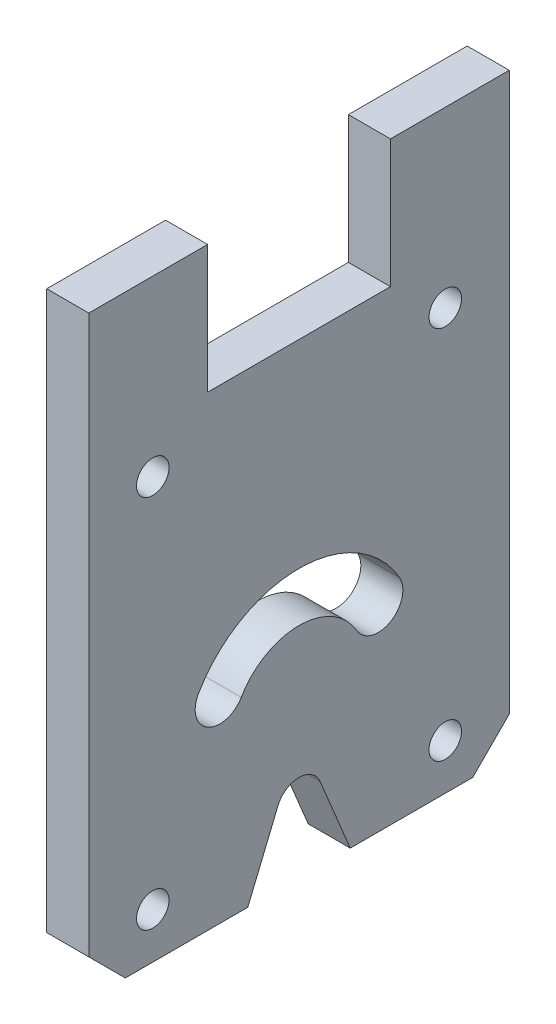
ISO-10303-21;
HEADER;
FILE_DESCRIPTION(('STEP AP214'),'2;1');
FILE_NAME('part.step','',(''),(''),'','','');
FILE_SCHEMA(('AUTOMOTIVE_DESIGN { 1 0 10303 214 1 1 1 1 }'));
ENDSEC;
DATA;
#1=APPLICATION_CONTEXT('core data for automotive mechanical design processes');
#2=APPLICATION_PROTOCOL_DEFINITION('international standard','automotive_design',2000,#1);
#3=PRODUCT_CONTEXT('',#1,'mechanical');
#4=PRODUCT('Part','Part','',(#3));
#5=PRODUCT_RELATED_PRODUCT_CATEGORY('part','',(#4));
#6=PRODUCT_DEFINITION_FORMATION('','',#4);
#7=PRODUCT_DEFINITION_CONTEXT('part definition',#1,'design');
#8=PRODUCT_DEFINITION('design','',#6,#7);
#9=PRODUCT_DEFINITION_SHAPE('','',#8);
#10=(LENGTH_UNIT() NAMED_UNIT(*) SI_UNIT(.MILLI.,.METRE.));
#11=(NAMED_UNIT(*) PLANE_ANGLE_UNIT() SI_UNIT($,.RADIAN.));
#12=(NAMED_UNIT(*) SI_UNIT($,.STERADIAN.) SOLID_ANGLE_UNIT());
#13=UNCERTAINTY_MEASURE_WITH_UNIT(LENGTH_MEASURE(1.E-05),#10,'distance_accuracy_value','');
#14=(GEOMETRIC_REPRESENTATION_CONTEXT(3) GLOBAL_UNCERTAINTY_ASSIGNED_CONTEXT((#13)) GLOBAL_UNIT_ASSIGNED_CONTEXT((#10,
#11,#12)) REPRESENTATION_CONTEXT('',''));
#15=CARTESIAN_POINT('',(0.,0.,0.));
#16=DIRECTION('',(0.,0.,1.));
#17=DIRECTION('',(1.,0.,0.));
#18=AXIS2_PLACEMENT_3D('',#15,#16,#17);
#19=CARTESIAN_POINT('',(-6.35,27.94,12.7));
#20=DIRECTION('',(0.,-1.,0.));
#21=DIRECTION('',(0.,0.,-1.));
#22=AXIS2_PLACEMENT_3D('',#19,#20,#21);
#23=PLANE('',#22);
#24=DIRECTION('',(-1.,0.,0.));
#25=VECTOR('',#24,1.);
#26=CARTESIAN_POINT('',(-3.42900000000001,27.94,-6.35));
#27=LINE('',#26,#25);
#28=CARTESIAN_POINT('',(6.35,27.94,-6.35));
#29=VERTEX_POINT('',#28);
#30=CARTESIAN_POINT('',(3.429,27.94,-6.35));
#31=VERTEX_POINT('',#30);
#32=EDGE_CURVE('E553',#29,#31,#27,.T.);
#33=ORIENTED_EDGE('',*,*,#32,.T.);
#34=DIRECTION('',(0.,0.,1.));
#35=VECTOR('',#34,1.);
#36=CARTESIAN_POINT('',(3.429,27.94,12.7));
#37=LINE('',#36,#35);
#38=CARTESIAN_POINT('',(3.429,27.94,6.35));
#39=VERTEX_POINT('',#38);
#40=EDGE_CURVE('E547',#31,#39,#37,.T.);
#41=ORIENTED_EDGE('',*,*,#40,.T.);
#42=DIRECTION('',(1.,0.,0.));
#43=VECTOR('',#42,1.);
#44=CARTESIAN_POINT('',(-3.42900000000001,27.94,6.35));
#45=LINE('',#44,#43);
#46=CARTESIAN_POINT('',(6.35,27.94,6.35));
#47=VERTEX_POINT('',#46);
#48=EDGE_CURVE('E569',#39,#47,#45,.T.);
#49=ORIENTED_EDGE('',*,*,#48,.T.);
#50=DIRECTION('',(0.,0.,1.));
#51=VECTOR('',#50,1.);
#52=CARTESIAN_POINT('',(6.35,27.94,12.7));
#53=LINE('',#52,#51);
#54=EDGE_CURVE('E658',#29,#47,#53,.T.);
#55=ORIENTED_EDGE('',*,*,#54,.F.);
#56=EDGE_LOOP('',(#33,#41,#49,#55));
#57=FACE_BOUND('',#56,.T.);
#58=ADVANCED_FACE('F374',(#57),#23,.F.);
#59=CARTESIAN_POINT('',(3.429,25.146,-12.7));
#60=DIRECTION('',(1.,0.,0.));
#61=DIRECTION('',(0.,0.,1.));
#62=AXIS2_PLACEMENT_3D('',#59,#60,#61);
#63=PLANE('',#62);
#64=CARTESIAN_POINT('',(3.429,6.096,0.));
#65=DIRECTION('',(-1.,0.,0.));
#66=DIRECTION('',(0.,0.,1.));
#67=AXIS2_PLACEMENT_3D('',#64,#65,#66);
#68=CIRCLE('',#67,8.0645);
#69=CARTESIAN_POINT('',(3.429,10.12825,6.98406186881961));
#70=VERTEX_POINT('',#69);
#71=CARTESIAN_POINT('',(3.429,10.12825,-6.98406186881961));
#72=VERTEX_POINT('',#71);
#73=EDGE_CURVE('E510',#70,#72,#68,.T.);
#74=ORIENTED_EDGE('',*,*,#73,.F.);
#75=CARTESIAN_POINT('',(3.429,9.27099999999999,5.49926131403119));
#76=DIRECTION('',(-1.,0.,0.));
#77=DIRECTION('',(0.,0.,-1.));
#78=AXIS2_PLACEMENT_3D('',#75,#76,#77);
#79=CIRCLE('',#78,1.7145);
#80=CARTESIAN_POINT('',(3.429,8.41374999999999,4.01446075924277));
#81=VERTEX_POINT('',#80);
#82=EDGE_CURVE('E389',#81,#70,#79,.T.);
#83=ORIENTED_EDGE('',*,*,#82,.F.);
#84=CARTESIAN_POINT('',(3.429,6.096,0.));
#85=DIRECTION('',(1.,0.,0.));
#86=DIRECTION('',(0.,0.,1.));
#87=AXIS2_PLACEMENT_3D('',#84,#85,#86);
#88=CIRCLE('',#87,4.6355);
#89=CARTESIAN_POINT('',(3.429,8.41374999999999,-4.01446075924277));
#90=VERTEX_POINT('',#89);
#91=EDGE_CURVE('E517',#90,#81,#88,.T.);
#92=ORIENTED_EDGE('',*,*,#91,.F.);
#93=CARTESIAN_POINT('',(3.429,9.27099999999999,-5.49926131403119));
#94=DIRECTION('',(-1.,0.,0.));
#95=DIRECTION('',(0.,0.,-1.));
#96=AXIS2_PLACEMENT_3D('',#93,#94,#95);
#97=CIRCLE('',#96,1.7145);
#98=EDGE_CURVE('E501',#72,#90,#97,.T.);
#99=ORIENTED_EDGE('',*,*,#98,.F.);
#100=EDGE_LOOP('',(#74,#83,#92,#99));
#101=FACE_BOUND('',#100,.T.);
#102=DIRECTION('',(0.,0.,-1.));
#103=VECTOR('',#102,1.);
#104=CARTESIAN_POINT('',(3.429,-4.445,-12.065));
#105=LINE('',#104,#103);
#106=CARTESIAN_POINT('',(3.429,-4.445,-3.55947690271257));
#107=VERTEX_POINT('',#106);
#108=CARTESIAN_POINT('',(3.429,-4.445,-12.065));
#109=VERTEX_POINT('',#108);
#110=EDGE_CURVE('E708',#107,#109,#105,.T.);
#111=ORIENTED_EDGE('',*,*,#110,.F.);
#112=DIRECTION('',(0.,0.923879532511288,0.382683432365087));
#113=VECTOR('',#112,1.);
#114=CARTESIAN_POINT('',(3.429,-4.445,-3.55947690271257));
#115=LINE('',#114,#113);
#116=CARTESIAN_POINT('',(3.429,0.607509948879576,-1.46665875786167));
#117=VERTEX_POINT('',#116);
#118=EDGE_CURVE('E648',#107,#117,#115,.T.);
#119=ORIENTED_EDGE('',*,*,#118,.T.);
#120=CARTESIAN_POINT('',(3.429,0.,0.));
#121=DIRECTION('',(-1.,0.,0.));
#122=DIRECTION('',(0.,0.,1.));
#123=AXIS2_PLACEMENT_3D('',#120,#121,#122);
#124=CIRCLE('',#123,1.5875);
#125=CARTESIAN_POINT('',(3.429,0.607509948879576,1.46665875786167));
#126=VERTEX_POINT('',#125);
#127=EDGE_CURVE('E704',#117,#126,#124,.F.);
#128=ORIENTED_EDGE('',*,*,#127,.T.);
#129=DIRECTION('',(0.,-0.923879532511288,0.382683432365087));
#130=VECTOR('',#129,1.);
#131=CARTESIAN_POINT('',(3.429,0.607509948879576,1.46665875786167));
#132=LINE('',#131,#130);
#133=CARTESIAN_POINT('',(3.429,-4.445,3.55947690271258));
#134=VERTEX_POINT('',#133);
#135=EDGE_CURVE('E701',#126,#134,#132,.T.);
#136=ORIENTED_EDGE('',*,*,#135,.T.);
#137=DIRECTION('',(0.,0.,-1.));
#138=VECTOR('',#137,1.);
#139=CARTESIAN_POINT('',(3.429,-4.445,12.065));
#140=LINE('',#139,#138);
#141=CARTESIAN_POINT('',(3.429,-4.445,12.065));
#142=VERTEX_POINT('',#141);
#143=EDGE_CURVE('E696',#142,#134,#140,.T.);
#144=ORIENTED_EDGE('',*,*,#143,.F.);
#145=DIRECTION('',(0.,-0.707106781186549,-0.707106781186546));
#146=VECTOR('',#145,1.);
#147=CARTESIAN_POINT('',(3.429,-1.90499999999999,14.605));
#148=LINE('',#147,#146);
#149=CARTESIAN_POINT('',(3.429,-1.90499999999999,14.605));
#150=VERTEX_POINT('',#149);
#151=EDGE_CURVE('E1005',#150,#142,#148,.T.);
#152=ORIENTED_EDGE('',*,*,#151,.F.);
#153=DIRECTION('',(0.,-1.,0.));
#154=VECTOR('',#153,1.);
#155=CARTESIAN_POINT('',(3.429,27.94,14.605));
#156=LINE('',#155,#154);
#157=CARTESIAN_POINT('',(3.429,36.83,14.605));
#158=VERTEX_POINT('',#157);
#159=EDGE_CURVE('E1000',#158,#150,#156,.T.);
#160=ORIENTED_EDGE('',*,*,#159,.F.);
#161=DIRECTION('',(0.,0.,-1.));
#162=VECTOR('',#161,1.);
#163=CARTESIAN_POINT('',(3.429,36.83,14.605));
#164=LINE('',#163,#162);
#165=CARTESIAN_POINT('',(3.429,36.83,6.35));
#166=VERTEX_POINT('',#165);
#167=EDGE_CURVE('E572',#158,#166,#164,.T.);
#168=ORIENTED_EDGE('',*,*,#167,.T.);
#169=DIRECTION('',(0.,1.,0.));
#170=VECTOR('',#169,1.);
#171=CARTESIAN_POINT('',(3.429,36.83,6.35));
#172=LINE('',#171,#170);
#173=EDGE_CURVE('E550',#39,#166,#172,.T.);
#174=ORIENTED_EDGE('',*,*,#173,.F.);
#175=ORIENTED_EDGE('',*,*,#40,.F.);
#176=DIRECTION('',(0.,-1.,0.));
#177=VECTOR('',#176,1.);
#178=CARTESIAN_POINT('',(3.429,36.83,-6.35));
#179=LINE('',#178,#177);
#180=CARTESIAN_POINT('',(3.429,36.83,-6.35));
#181=VERTEX_POINT('',#180);
#182=EDGE_CURVE('E544',#181,#31,#179,.T.);
#183=ORIENTED_EDGE('',*,*,#182,.F.);
#184=DIRECTION('',(0.,0.,-1.));
#185=VECTOR('',#184,1.);
#186=CARTESIAN_POINT('',(3.429,36.83,-12.7));
#187=LINE('',#186,#185);
#188=CARTESIAN_POINT('',(3.429,36.83,-14.605));
#189=VERTEX_POINT('',#188);
#190=EDGE_CURVE('E556',#181,#189,#187,.T.);
#191=ORIENTED_EDGE('',*,*,#190,.T.);
#192=DIRECTION('',(0.,1.,0.));
#193=VECTOR('',#192,1.);
#194=CARTESIAN_POINT('',(3.429,27.94,-14.605));
#195=LINE('',#194,#193);
#196=CARTESIAN_POINT('',(3.429,-1.90499999999999,-14.605));
#197=VERTEX_POINT('',#196);
#198=EDGE_CURVE('E1011',#197,#189,#195,.T.);
#199=ORIENTED_EDGE('',*,*,#198,.F.);
#200=DIRECTION('',(0.,0.707106781186549,-0.707106781186546));
#201=VECTOR('',#200,1.);
#202=CARTESIAN_POINT('',(3.429,-1.90499999999999,-14.605));
#203=LINE('',#202,#201);
#204=EDGE_CURVE('E1012',#109,#197,#203,.T.);
#205=ORIENTED_EDGE('',*,*,#204,.F.);
#206=EDGE_LOOP('',(#111,#119,#128,#136,#144,#152,#160,#168,#174,#175,#183,#191,#199,#205));
#207=FACE_BOUND('',#206,.T.);
#208=CARTESIAN_POINT('',(3.429,-1.26999999999998,10.16));
#209=DIRECTION('',(1.,0.,0.));
#210=DIRECTION('',(0.,0.,-1.));
#211=AXIS2_PLACEMENT_3D('',#208,#209,#210);
#212=CIRCLE('',#211,1.1303);
#213=CARTESIAN_POINT('',(3.429,-1.26999999999998,9.0297));
#214=VERTEX_POINT('',#213);
#215=EDGE_CURVE('E541',#214,#214,#212,.F.);
#216=ORIENTED_EDGE('',*,*,#215,.F.);
#217=EDGE_LOOP('',(#216));
#218=FACE_BOUND('',#217,.T.);
#219=CARTESIAN_POINT('',(3.429,24.765,10.16));
#220=DIRECTION('',(1.,0.,0.));
#221=DIRECTION('',(0.,0.,-1.));
#222=AXIS2_PLACEMENT_3D('',#219,#220,#221);
#223=CIRCLE('',#222,1.1303);
#224=CARTESIAN_POINT('',(3.429,24.765,9.0297));
#225=VERTEX_POINT('',#224);
#226=EDGE_CURVE('E535',#225,#225,#223,.F.);
#227=ORIENTED_EDGE('',*,*,#226,.F.);
#228=EDGE_LOOP('',(#227));
#229=FACE_BOUND('',#228,.T.);
#230=CARTESIAN_POINT('',(3.429,24.765,-10.16));
#231=DIRECTION('',(1.,0.,0.));
#232=DIRECTION('',(0.,0.,-1.));
#233=AXIS2_PLACEMENT_3D('',#230,#231,#232);
#234=CIRCLE('',#233,1.1303);
#235=CARTESIAN_POINT('',(3.429,24.765,-11.2903));
#236=VERTEX_POINT('',#235);
#237=EDGE_CURVE('E534',#236,#236,#234,.F.);
#238=ORIENTED_EDGE('',*,*,#237,.F.);
#239=EDGE_LOOP('',(#238));
#240=FACE_BOUND('',#239,.T.);
#241=CARTESIAN_POINT('',(3.429,-1.26999999999998,-10.16));
#242=DIRECTION('',(1.,0.,0.));
#243=DIRECTION('',(0.,0.,-1.));
#244=AXIS2_PLACEMENT_3D('',#241,#242,#243);
#245=CIRCLE('',#244,1.1303);
#246=CARTESIAN_POINT('',(3.429,-1.26999999999998,-11.2903));
#247=VERTEX_POINT('',#246);
#248=EDGE_CURVE('E538',#247,#247,#245,.F.);
#249=ORIENTED_EDGE('',*,*,#248,.F.);
#250=EDGE_LOOP('',(#249));
#251=FACE_BOUND('',#250,.T.);
#252=CARTESIAN_POINT('',(3.429,14.986,8.255));
#253=DIRECTION('',(-1.,0.,0.));
#254=DIRECTION('',(0.,0.,1.));
#255=AXIS2_PLACEMENT_3D('',#252,#253,#254);
#256=CIRCLE('',#255,1.190625);
#257=CARTESIAN_POINT('',(3.429,14.986,9.445625));
#258=VERTEX_POINT('',#257);
#259=EDGE_CURVE('E530',#258,#258,#256,.T.);
#260=ORIENTED_EDGE('',*,*,#259,.F.);
#261=EDGE_LOOP('',(#260));
#262=FACE_BOUND('',#261,.T.);
#263=CARTESIAN_POINT('',(3.429,6.096,0.));
#264=DIRECTION('',(-1.,0.,0.));
#265=DIRECTION('',(0.,0.,1.));
#266=AXIS2_PLACEMENT_3D('',#263,#264,#265);
#267=CIRCLE('',#266,1.190625);
#268=CARTESIAN_POINT('',(3.429,6.096,1.190625));
#269=VERTEX_POINT('',#268);
#270=EDGE_CURVE('E527',#269,#269,#267,.T.);
#271=ORIENTED_EDGE('',*,*,#270,.F.);
#272=EDGE_LOOP('',(#271));
#273=FACE_BOUND('',#272,.T.);
#274=ADVANCED_FACE('F514',(#101,#207,#218,#229,#240,#251,#262,#273),#63,.F.);
#275=CARTESIAN_POINT('',(6.35,0.,0.));
#276=DIRECTION('',(1.,0.,0.));
#277=DIRECTION('',(0.,0.,1.));
#278=AXIS2_PLACEMENT_3D('',#275,#276,#277);
#279=PLANE('',#278);
#280=CARTESIAN_POINT('',(6.35,9.27099999999999,5.49926131403119));
#281=DIRECTION('',(1.,0.,0.));
#282=DIRECTION('',(0.,0.,-1.));
#283=AXIS2_PLACEMENT_3D('',#280,#281,#282);
#284=CIRCLE('',#283,1.7145);
#285=CARTESIAN_POINT('',(6.35,10.12825,6.98406186881961));
#286=VERTEX_POINT('',#285);
#287=CARTESIAN_POINT('',(6.35,8.41374999999999,4.01446075924277));
#288=VERTEX_POINT('',#287);
#289=EDGE_CURVE('E12',#286,#288,#284,.T.);
#290=ORIENTED_EDGE('',*,*,#289,.F.);
#291=CARTESIAN_POINT('',(6.35,6.096,0.));
#292=DIRECTION('',(1.,0.,0.));
#293=DIRECTION('',(0.,0.,-1.));
#294=AXIS2_PLACEMENT_3D('',#291,#292,#293);
#295=CIRCLE('',#294,8.0645);
#296=CARTESIAN_POINT('',(6.35,10.12825,-6.98406186881961));
#297=VERTEX_POINT('',#296);
#298=EDGE_CURVE('E588',#297,#286,#295,.T.);
#299=ORIENTED_EDGE('',*,*,#298,.F.);
#300=CARTESIAN_POINT('',(6.35,9.27099999999999,-5.49926131403119));
#301=DIRECTION('',(1.,0.,0.));
#302=DIRECTION('',(0.,0.,-1.));
#303=AXIS2_PLACEMENT_3D('',#300,#301,#302);
#304=CIRCLE('',#303,1.7145);
#305=CARTESIAN_POINT('',(6.35,8.41374999999999,-4.01446075924277));
#306=VERTEX_POINT('',#305);
#307=EDGE_CURVE('E504',#306,#297,#304,.T.);
#308=ORIENTED_EDGE('',*,*,#307,.F.);
#309=CARTESIAN_POINT('',(6.35,6.096,0.));
#310=DIRECTION('',(1.,0.,0.));
#311=DIRECTION('',(0.,0.,-1.));
#312=AXIS2_PLACEMENT_3D('',#309,#310,#311);
#313=CIRCLE('',#312,4.6355);
#314=EDGE_CURVE('E382',#288,#306,#313,.F.);
#315=ORIENTED_EDGE('',*,*,#314,.F.);
#316=EDGE_LOOP('',(#290,#299,#308,#315));
#317=FACE_BOUND('',#316,.T.);
#318=CARTESIAN_POINT('',(6.35,24.765,-10.16));
#319=DIRECTION('',(1.,0.,0.));
#320=DIRECTION('',(0.,0.,-1.));
#321=AXIS2_PLACEMENT_3D('',#318,#319,#320);
#322=CIRCLE('',#321,1.1303);
#323=CARTESIAN_POINT('',(6.35,24.765,-11.2903));
#324=VERTEX_POINT('',#323);
#325=EDGE_CURVE('E524',#324,#324,#322,.T.);
#326=ORIENTED_EDGE('',*,*,#325,.F.);
#327=EDGE_LOOP('',(#326));
#328=FACE_BOUND('',#327,.T.);
#329=CARTESIAN_POINT('',(6.35,-1.26999999999998,-10.16));
#330=DIRECTION('',(1.,0.,0.));
#331=DIRECTION('',(0.,0.,-1.));
#332=AXIS2_PLACEMENT_3D('',#329,#330,#331);
#333=CIRCLE('',#332,1.1303);
#334=CARTESIAN_POINT('',(6.35,-1.26999999999998,-11.2903));
#335=VERTEX_POINT('',#334);
#336=EDGE_CURVE('E583',#335,#335,#333,.T.);
#337=ORIENTED_EDGE('',*,*,#336,.F.);
#338=EDGE_LOOP('',(#337));
#339=FACE_BOUND('',#338,.T.);
#340=CARTESIAN_POINT('',(6.35,24.765,10.16));
#341=DIRECTION('',(1.,0.,0.));
#342=DIRECTION('',(0.,0.,-1.));
#343=AXIS2_PLACEMENT_3D('',#340,#341,#342);
#344=CIRCLE('',#343,1.1303);
#345=CARTESIAN_POINT('',(6.35,24.765,9.0297));
#346=VERTEX_POINT('',#345);
#347=EDGE_CURVE('E580',#346,#346,#344,.T.);
#348=ORIENTED_EDGE('',*,*,#347,.F.);
#349=EDGE_LOOP('',(#348));
#350=FACE_BOUND('',#349,.T.);
#351=CARTESIAN_POINT('',(6.35,-1.26999999999998,10.16));
#352=DIRECTION('',(1.,0.,0.));
#353=DIRECTION('',(0.,0.,-1.));
#354=AXIS2_PLACEMENT_3D('',#351,#352,#353);
#355=CIRCLE('',#354,1.1303);
#356=CARTESIAN_POINT('',(6.35,-1.26999999999998,9.0297));
#357=VERTEX_POINT('',#356);
#358=EDGE_CURVE('E531',#357,#357,#355,.T.);
#359=ORIENTED_EDGE('',*,*,#358,.F.);
#360=EDGE_LOOP('',(#359));
#361=FACE_BOUND('',#360,.T.);
#362=DIRECTION('',(0.,-0.707106781186549,0.707106781186546));
#363=VECTOR('',#362,1.);
#364=CARTESIAN_POINT('',(6.35,-1.90499999999999,-14.605));
#365=LINE('',#364,#363);
#366=CARTESIAN_POINT('',(6.35,-1.90499999999999,-14.605));
#367=VERTEX_POINT('',#366);
#368=CARTESIAN_POINT('',(6.35,-4.445,-12.065));
#369=VERTEX_POINT('',#368);
#370=EDGE_CURVE('E999',#367,#369,#365,.T.);
#371=ORIENTED_EDGE('',*,*,#370,.F.);
#372=DIRECTION('',(0.,-1.,0.));
#373=VECTOR('',#372,1.);
#374=CARTESIAN_POINT('',(6.35,27.94,-14.605));
#375=LINE('',#374,#373);
#376=CARTESIAN_POINT('',(6.35,36.83,-14.605));
#377=VERTEX_POINT('',#376);
#378=EDGE_CURVE('E998',#377,#367,#375,.T.);
#379=ORIENTED_EDGE('',*,*,#378,.F.);
#380=DIRECTION('',(0.,0.,1.));
#381=VECTOR('',#380,1.);
#382=CARTESIAN_POINT('',(6.35,36.83,-14.605));
#383=LINE('',#382,#381);
#384=CARTESIAN_POINT('',(6.35,36.83,-6.35));
#385=VERTEX_POINT('',#384);
#386=EDGE_CURVE('E561',#377,#385,#383,.T.);
#387=ORIENTED_EDGE('',*,*,#386,.T.);
#388=DIRECTION('',(0.,-1.,0.));
#389=VECTOR('',#388,1.);
#390=CARTESIAN_POINT('',(6.35,36.83,-6.35));
#391=LINE('',#390,#389);
#392=EDGE_CURVE('E567',#385,#29,#391,.T.);
#393=ORIENTED_EDGE('',*,*,#392,.T.);
#394=ORIENTED_EDGE('',*,*,#54,.T.);
#395=DIRECTION('',(0.,-1.,0.));
#396=VECTOR('',#395,1.);
#397=CARTESIAN_POINT('',(6.35,36.83,6.35));
#398=LINE('',#397,#396);
#399=CARTESIAN_POINT('',(6.35,36.83,6.35));
#400=VERTEX_POINT('',#399);
#401=EDGE_CURVE('E676',#400,#47,#398,.T.);
#402=ORIENTED_EDGE('',*,*,#401,.F.);
#403=DIRECTION('',(0.,0.,1.));
#404=VECTOR('',#403,1.);
#405=CARTESIAN_POINT('',(6.35,36.83,6.35));
#406=LINE('',#405,#404);
#407=CARTESIAN_POINT('',(6.35,36.83,14.605));
#408=VERTEX_POINT('',#407);
#409=EDGE_CURVE('E1027',#400,#408,#406,.T.);
#410=ORIENTED_EDGE('',*,*,#409,.T.);
#411=DIRECTION('',(0.,1.,0.));
#412=VECTOR('',#411,1.);
#413=CARTESIAN_POINT('',(6.35,27.94,14.605));
#414=LINE('',#413,#412);
#415=CARTESIAN_POINT('',(6.35,-1.90499999999999,14.605));
#416=VERTEX_POINT('',#415);
#417=EDGE_CURVE('E1018',#416,#408,#414,.T.);
#418=ORIENTED_EDGE('',*,*,#417,.F.);
#419=DIRECTION('',(0.,0.707106781186549,0.707106781186546));
#420=VECTOR('',#419,1.);
#421=CARTESIAN_POINT('',(6.35,-1.90499999999999,14.605));
#422=LINE('',#421,#420);
#423=CARTESIAN_POINT('',(6.35,-4.445,12.065));
#424=VERTEX_POINT('',#423);
#425=EDGE_CURVE('E679',#424,#416,#422,.T.);
#426=ORIENTED_EDGE('',*,*,#425,.F.);
#427=DIRECTION('',(0.,0.,-1.));
#428=VECTOR('',#427,1.);
#429=CARTESIAN_POINT('',(6.35,-4.445,3.55947690271257));
#430=LINE('',#429,#428);
#431=CARTESIAN_POINT('',(6.35,-4.445,3.55947690271257));
#432=VERTEX_POINT('',#431);
#433=EDGE_CURVE('E670',#424,#432,#430,.T.);
#434=ORIENTED_EDGE('',*,*,#433,.T.);
#435=DIRECTION('',(0.,0.923879532511288,-0.382683432365088));
#436=VECTOR('',#435,1.);
#437=CARTESIAN_POINT('',(6.35,0.607509948879576,1.46665875786167));
#438=LINE('',#437,#436);
#439=CARTESIAN_POINT('',(6.35,0.607509948879576,1.46665875786167));
#440=VERTEX_POINT('',#439);
#441=EDGE_CURVE('E684',#432,#440,#438,.T.);
#442=ORIENTED_EDGE('',*,*,#441,.T.);
#443=CARTESIAN_POINT('',(6.35,0.,0.));
#444=DIRECTION('',(-1.,0.,0.));
#445=DIRECTION('',(0.,0.,1.));
#446=AXIS2_PLACEMENT_3D('',#443,#444,#445);
#447=CIRCLE('',#446,1.5875);
#448=CARTESIAN_POINT('',(6.35,0.607509948879576,-1.46665875786167));
#449=VERTEX_POINT('',#448);
#450=EDGE_CURVE('E662',#440,#449,#447,.T.);
#451=ORIENTED_EDGE('',*,*,#450,.T.);
#452=DIRECTION('',(0.,-0.923879532511288,-0.382683432365088));
#453=VECTOR('',#452,1.);
#454=CARTESIAN_POINT('',(6.35,-4.445,-3.55947690271257));
#455=LINE('',#454,#453);
#456=CARTESIAN_POINT('',(6.35,-4.445,-3.55947690271257));
#457=VERTEX_POINT('',#456);
#458=EDGE_CURVE('E645',#449,#457,#455,.T.);
#459=ORIENTED_EDGE('',*,*,#458,.T.);
#460=DIRECTION('',(0.,0.,-1.));
#461=VECTOR('',#460,1.);
#462=CARTESIAN_POINT('',(6.35,-4.445,-12.7));
#463=LINE('',#462,#461);
#464=EDGE_CURVE('E653',#457,#369,#463,.T.);
#465=ORIENTED_EDGE('',*,*,#464,.T.);
#466=EDGE_LOOP('',(#371,#379,#387,#393,#394,#402,#410,#418,#426,#434,#442,#451,#459,#465));
#467=FACE_BOUND('',#466,.T.);
#468=ADVANCED_FACE('F597',(#317,#328,#339,#350,#361,#467),#279,.T.);
#469=CARTESIAN_POINT('',(-6.35,0.607509948879576,1.46665875786167));
#470=DIRECTION('',(0.,0.382683432365087,0.923879532511288));
#471=DIRECTION('',(0.,-0.923879532511288,0.382683432365087));
#472=AXIS2_PLACEMENT_3D('',#469,#470,#471);
#473=PLANE('',#472);
#474=ORIENTED_EDGE('',*,*,#135,.F.);
#475=DIRECTION('',(1.,0.,0.));
#476=VECTOR('',#475,1.);
#477=CARTESIAN_POINT('',(-6.35,0.607509948879576,1.46665875786167));
#478=LINE('',#477,#476);
#479=EDGE_CURVE('E683',#126,#440,#478,.T.);
#480=ORIENTED_EDGE('',*,*,#479,.T.);
#481=ORIENTED_EDGE('',*,*,#441,.F.);
#482=DIRECTION('',(1.,0.,0.));
#483=VECTOR('',#482,1.);
#484=CARTESIAN_POINT('',(-6.35,-4.445,3.55947690271257));
#485=LINE('',#484,#483);
#486=EDGE_CURVE('E650',#134,#432,#485,.T.);
#487=ORIENTED_EDGE('',*,*,#486,.F.);
#488=EDGE_LOOP('',(#474,#480,#481,#487));
#489=FACE_BOUND('',#488,.T.);
#490=ADVANCED_FACE('F700',(#489),#473,.F.);
#491=CARTESIAN_POINT('',(-6.35,-4.445,3.55947690271257));
#492=DIRECTION('',(0.,1.,0.));
#493=DIRECTION('',(0.,0.,1.));
#494=AXIS2_PLACEMENT_3D('',#491,#492,#493);
#495=PLANE('',#494);
#496=ORIENTED_EDGE('',*,*,#143,.T.);
#497=ORIENTED_EDGE('',*,*,#486,.T.);
#498=ORIENTED_EDGE('',*,*,#433,.F.);
#499=DIRECTION('',(1.,0.,0.));
#500=VECTOR('',#499,1.);
#501=CARTESIAN_POINT('',(-29.2596256976337,-4.445,12.065));
#502=LINE('',#501,#500);
#503=EDGE_CURVE('E693',#142,#424,#502,.T.);
#504=ORIENTED_EDGE('',*,*,#503,.F.);
#505=EDGE_LOOP('',(#496,#497,#498,#504));
#506=FACE_BOUND('',#505,.T.);
#507=ADVANCED_FACE('F625',(#506),#495,.F.);
#508=CARTESIAN_POINT('',(-6.35,-4.445,-12.7));
#509=DIRECTION('',(0.,1.,0.));
#510=DIRECTION('',(0.,0.,1.));
#511=AXIS2_PLACEMENT_3D('',#508,#509,#510);
#512=PLANE('',#511);
#513=DIRECTION('',(1.,0.,0.));
#514=VECTOR('',#513,1.);
#515=CARTESIAN_POINT('',(-6.35,-4.445,-3.55947690271257));
#516=LINE('',#515,#514);
#517=EDGE_CURVE('E642',#107,#457,#516,.T.);
#518=ORIENTED_EDGE('',*,*,#517,.F.);
#519=ORIENTED_EDGE('',*,*,#110,.T.);
#520=DIRECTION('',(1.,0.,0.));
#521=VECTOR('',#520,1.);
#522=CARTESIAN_POINT('',(-29.2596256976337,-4.445,-12.065));
#523=LINE('',#522,#521);
#524=EDGE_CURVE('E654',#109,#369,#523,.T.);
#525=ORIENTED_EDGE('',*,*,#524,.T.);
#526=ORIENTED_EDGE('',*,*,#464,.F.);
#527=EDGE_LOOP('',(#518,#519,#525,#526));
#528=FACE_BOUND('',#527,.T.);
#529=ADVANCED_FACE('F627',(#528),#512,.F.);
#530=CARTESIAN_POINT('',(-6.35,-4.445,-3.55947690271257));
#531=DIRECTION('',(0.,0.382683432365087,-0.923879532511288));
#532=DIRECTION('',(0.,0.923879532511288,0.382683432365087));
#533=AXIS2_PLACEMENT_3D('',#530,#531,#532);
#534=PLANE('',#533);
#535=ORIENTED_EDGE('',*,*,#517,.T.);
#536=ORIENTED_EDGE('',*,*,#458,.F.);
#537=DIRECTION('',(1.,0.,0.));
#538=VECTOR('',#537,1.);
#539=CARTESIAN_POINT('',(-6.35,0.607509948879576,-1.46665875786167));
#540=LINE('',#539,#538);
#541=EDGE_CURVE('E590',#117,#449,#540,.T.);
#542=ORIENTED_EDGE('',*,*,#541,.F.);
#543=ORIENTED_EDGE('',*,*,#118,.F.);
#544=EDGE_LOOP('',(#535,#536,#542,#543));
#545=FACE_BOUND('',#544,.T.);
#546=ADVANCED_FACE('F629',(#545),#534,.F.);
#547=CARTESIAN_POINT('',(-6.35,0.,0.));
#548=DIRECTION('',(1.,0.,0.));
#549=DIRECTION('',(0.,0.,1.));
#550=AXIS2_PLACEMENT_3D('',#547,#548,#549);
#551=CYLINDRICAL_SURFACE('',#550,1.5875);
#552=ORIENTED_EDGE('',*,*,#541,.T.);
#553=ORIENTED_EDGE('',*,*,#450,.F.);
#554=ORIENTED_EDGE('',*,*,#479,.F.);
#555=ORIENTED_EDGE('',*,*,#127,.F.);
#556=EDGE_LOOP('',(#552,#553,#554,#555));
#557=FACE_BOUND('',#556,.T.);
#558=ADVANCED_FACE('F376',(#557),#551,.F.);
#559=CARTESIAN_POINT('',(-29.2596256976337,-1.90499999999999,-14.605));
#560=DIRECTION('',(0.,-0.707106781186546,-0.707106781186549));
#561=DIRECTION('',(0.,0.707106781186549,-0.707106781186546));
#562=AXIS2_PLACEMENT_3D('',#559,#560,#561);
#563=PLANE('',#562);
#564=ORIENTED_EDGE('',*,*,#204,.T.);
#565=DIRECTION('',(1.,0.,0.));
#566=VECTOR('',#565,1.);
#567=CARTESIAN_POINT('',(-29.2596256976337,-1.90499999999999,-14.605));
#568=LINE('',#567,#566);
#569=EDGE_CURVE('E1002',#197,#367,#568,.T.);
#570=ORIENTED_EDGE('',*,*,#569,.T.);
#571=ORIENTED_EDGE('',*,*,#370,.T.);
#572=ORIENTED_EDGE('',*,*,#524,.F.);
#573=EDGE_LOOP('',(#564,#570,#571,#572));
#574=FACE_BOUND('',#573,.T.);
#575=ADVANCED_FACE('F637',(#574),#563,.T.);
#576=CARTESIAN_POINT('',(-29.2596256976337,27.94,-14.605));
#577=DIRECTION('',(0.,0.,-1.));
#578=DIRECTION('',(0.,1.,0.));
#579=AXIS2_PLACEMENT_3D('',#576,#577,#578);
#580=PLANE('',#579);
#581=ORIENTED_EDGE('',*,*,#198,.T.);
#582=DIRECTION('',(1.,0.,0.));
#583=VECTOR('',#582,1.);
#584=CARTESIAN_POINT('',(3.429,36.83,-14.605));
#585=LINE('',#584,#583);
#586=EDGE_CURVE('E559',#189,#377,#585,.T.);
#587=ORIENTED_EDGE('',*,*,#586,.T.);
#588=ORIENTED_EDGE('',*,*,#378,.T.);
#589=ORIENTED_EDGE('',*,*,#569,.F.);
#590=EDGE_LOOP('',(#581,#587,#588,#589));
#591=FACE_BOUND('',#590,.T.);
#592=ADVANCED_FACE('F789',(#591),#580,.T.);
#593=CARTESIAN_POINT('',(-29.2596256976337,27.94,14.605));
#594=DIRECTION('',(0.,0.,1.));
#595=DIRECTION('',(0.,-1.,0.));
#596=AXIS2_PLACEMENT_3D('',#593,#594,#595);
#597=PLANE('',#596);
#598=ORIENTED_EDGE('',*,*,#159,.T.);
#599=DIRECTION('',(1.,0.,0.));
#600=VECTOR('',#599,1.);
#601=CARTESIAN_POINT('',(-29.2596256976337,-1.90499999999999,14.605));
#602=LINE('',#601,#600);
#603=EDGE_CURVE('E1017',#150,#416,#602,.T.);
#604=ORIENTED_EDGE('',*,*,#603,.T.);
#605=ORIENTED_EDGE('',*,*,#417,.T.);
#606=DIRECTION('',(-1.,0.,0.));
#607=VECTOR('',#606,1.);
#608=CARTESIAN_POINT('',(6.35,36.83,14.605));
#609=LINE('',#608,#607);
#610=EDGE_CURVE('E680',#408,#158,#609,.T.);
#611=ORIENTED_EDGE('',*,*,#610,.T.);
#612=EDGE_LOOP('',(#598,#604,#605,#611));
#613=FACE_BOUND('',#612,.T.);
#614=ADVANCED_FACE('F797',(#613),#597,.T.);
#615=CARTESIAN_POINT('',(-29.2596256976337,-1.90499999999999,14.605));
#616=DIRECTION('',(0.,-0.707106781186546,0.707106781186549));
#617=DIRECTION('',(0.,-0.707106781186549,-0.707106781186546));
#618=AXIS2_PLACEMENT_3D('',#615,#616,#617);
#619=PLANE('',#618);
#620=ORIENTED_EDGE('',*,*,#151,.T.);
#621=ORIENTED_EDGE('',*,*,#503,.T.);
#622=ORIENTED_EDGE('',*,*,#425,.T.);
#623=ORIENTED_EDGE('',*,*,#603,.F.);
#624=EDGE_LOOP('',(#620,#621,#622,#623));
#625=FACE_BOUND('',#624,.T.);
#626=ADVANCED_FACE('F807',(#625),#619,.T.);
#627=CARTESIAN_POINT('',(3.429,36.83,14.605));
#628=DIRECTION('',(0.,-1.,0.));
#629=DIRECTION('',(0.,0.,-1.));
#630=AXIS2_PLACEMENT_3D('',#627,#628,#629);
#631=PLANE('',#630);
#632=DIRECTION('',(1.,0.,0.));
#633=VECTOR('',#632,1.);
#634=CARTESIAN_POINT('',(-3.42900000000001,36.83,6.35));
#635=LINE('',#634,#633);
#636=EDGE_CURVE('E994',#166,#400,#635,.T.);
#637=ORIENTED_EDGE('',*,*,#636,.F.);
#638=ORIENTED_EDGE('',*,*,#167,.F.);
#639=ORIENTED_EDGE('',*,*,#610,.F.);
#640=ORIENTED_EDGE('',*,*,#409,.F.);
#641=EDGE_LOOP('',(#637,#638,#639,#640));
#642=FACE_BOUND('',#641,.T.);
#643=ADVANCED_FACE('F817',(#642),#631,.F.);
#644=CARTESIAN_POINT('',(-3.42900000000001,36.83,6.35));
#645=DIRECTION('',(0.,0.,1.));
#646=DIRECTION('',(-1.,0.,0.));
#647=AXIS2_PLACEMENT_3D('',#644,#645,#646);
#648=PLANE('',#647);
#649=ORIENTED_EDGE('',*,*,#48,.F.);
#650=ORIENTED_EDGE('',*,*,#173,.T.);
#651=ORIENTED_EDGE('',*,*,#636,.T.);
#652=ORIENTED_EDGE('',*,*,#401,.T.);
#653=EDGE_LOOP('',(#649,#650,#651,#652));
#654=FACE_BOUND('',#653,.T.);
#655=ADVANCED_FACE('F825',(#654),#648,.F.);
#656=CARTESIAN_POINT('',(-3.42900000000001,36.83,-12.7));
#657=DIRECTION('',(0.,1.,0.));
#658=DIRECTION('',(0.,0.,1.));
#659=AXIS2_PLACEMENT_3D('',#656,#657,#658);
#660=PLANE('',#659);
#661=ORIENTED_EDGE('',*,*,#190,.F.);
#662=DIRECTION('',(-1.,0.,0.));
#663=VECTOR('',#662,1.);
#664=CARTESIAN_POINT('',(-3.42900000000001,36.83,-6.35));
#665=LINE('',#664,#663);
#666=EDGE_CURVE('E564',#385,#181,#665,.T.);
#667=ORIENTED_EDGE('',*,*,#666,.F.);
#668=ORIENTED_EDGE('',*,*,#386,.F.);
#669=ORIENTED_EDGE('',*,*,#586,.F.);
#670=EDGE_LOOP('',(#661,#667,#668,#669));
#671=FACE_BOUND('',#670,.T.);
#672=ADVANCED_FACE('F833',(#671),#660,.T.);
#673=CARTESIAN_POINT('',(-3.42900000000001,36.83,-6.35));
#674=DIRECTION('',(0.,0.,-1.));
#675=DIRECTION('',(1.,0.,0.));
#676=AXIS2_PLACEMENT_3D('',#673,#674,#675);
#677=PLANE('',#676);
#678=ORIENTED_EDGE('',*,*,#666,.T.);
#679=ORIENTED_EDGE('',*,*,#182,.T.);
#680=ORIENTED_EDGE('',*,*,#32,.F.);
#681=ORIENTED_EDGE('',*,*,#392,.F.);
#682=EDGE_LOOP('',(#678,#679,#680,#681));
#683=FACE_BOUND('',#682,.T.);
#684=ADVANCED_FACE('F841',(#683),#677,.F.);
#685=CARTESIAN_POINT('',(9.54697117910062,24.765,10.16));
#686=DIRECTION('',(-1.,0.,0.));
#687=DIRECTION('',(0.,1.,0.));
#688=AXIS2_PLACEMENT_3D('',#685,#686,#687);
#689=CYLINDRICAL_SURFACE('',#688,1.1303);
#690=ORIENTED_EDGE('',*,*,#226,.T.);
#691=EDGE_LOOP('',(#690));
#692=FACE_BOUND('',#691,.T.);
#693=ORIENTED_EDGE('',*,*,#347,.T.);
#694=EDGE_LOOP('',(#693));
#695=FACE_BOUND('',#694,.T.);
#696=ADVANCED_FACE('F848',(#692,#695),#689,.F.);
#697=CARTESIAN_POINT('',(9.54697117910069,-1.26999999999996,10.16));
#698=DIRECTION('',(-1.,0.,0.));
#699=DIRECTION('',(0.,1.,0.));
#700=AXIS2_PLACEMENT_3D('',#697,#698,#699);
#701=CYLINDRICAL_SURFACE('',#700,1.1303);
#702=ORIENTED_EDGE('',*,*,#215,.T.);
#703=EDGE_LOOP('',(#702));
#704=FACE_BOUND('',#703,.T.);
#705=ORIENTED_EDGE('',*,*,#358,.T.);
#706=EDGE_LOOP('',(#705));
#707=FACE_BOUND('',#706,.T.);
#708=ADVANCED_FACE('F852',(#704,#707),#701,.F.);
#709=CARTESIAN_POINT('',(9.54697117910062,24.765,-10.16));
#710=DIRECTION('',(-1.,0.,0.));
#711=DIRECTION('',(0.,1.,0.));
#712=AXIS2_PLACEMENT_3D('',#709,#710,#711);
#713=CYLINDRICAL_SURFACE('',#712,1.1303);
#714=ORIENTED_EDGE('',*,*,#237,.T.);
#715=EDGE_LOOP('',(#714));
#716=FACE_BOUND('',#715,.T.);
#717=ORIENTED_EDGE('',*,*,#325,.T.);
#718=EDGE_LOOP('',(#717));
#719=FACE_BOUND('',#718,.T.);
#720=ADVANCED_FACE('F858',(#716,#719),#713,.F.);
#721=CARTESIAN_POINT('',(9.54697117910069,-1.26999999999996,-10.16));
#722=DIRECTION('',(-1.,0.,0.));
#723=DIRECTION('',(0.,1.,0.));
#724=AXIS2_PLACEMENT_3D('',#721,#722,#723);
#725=CYLINDRICAL_SURFACE('',#724,1.1303);
#726=ORIENTED_EDGE('',*,*,#248,.T.);
#727=EDGE_LOOP('',(#726));
#728=FACE_BOUND('',#727,.T.);
#729=ORIENTED_EDGE('',*,*,#336,.T.);
#730=EDGE_LOOP('',(#729));
#731=FACE_BOUND('',#730,.T.);
#732=ADVANCED_FACE('F735',(#728,#731),#725,.F.);
#733=CARTESIAN_POINT('',(5.334,14.986,8.255));
#734=DIRECTION('',(1.,0.,0.));
#735=DIRECTION('',(0.,0.,1.));
#736=AXIS2_PLACEMENT_3D('',#733,#734,#735);
#737=PLANE('',#736);
#738=CARTESIAN_POINT('',(5.334,14.986,8.255));
#739=DIRECTION('',(-1.,0.,0.));
#740=DIRECTION('',(0.,0.,1.));
#741=AXIS2_PLACEMENT_3D('',#738,#739,#740);
#742=CIRCLE('',#741,1.190625);
#743=CARTESIAN_POINT('',(5.334,14.986,9.445625));
#744=VERTEX_POINT('',#743);
#745=EDGE_CURVE('E664',#744,#744,#742,.T.);
#746=ORIENTED_EDGE('',*,*,#745,.T.);
#747=EDGE_LOOP('',(#746));
#748=FACE_BOUND('',#747,.T.);
#749=ADVANCED_FACE('F717',(#748),#737,.F.);
#750=CARTESIAN_POINT('',(-6.35,14.986,8.255));
#751=DIRECTION('',(1.,0.,0.));
#752=DIRECTION('',(0.,0.,1.));
#753=AXIS2_PLACEMENT_3D('',#750,#751,#752);
#754=CYLINDRICAL_SURFACE('',#753,1.190625);
#755=ORIENTED_EDGE('',*,*,#745,.F.);
#756=EDGE_LOOP('',(#755));
#757=FACE_BOUND('',#756,.T.);
#758=ORIENTED_EDGE('',*,*,#259,.T.);
#759=EDGE_LOOP('',(#758));
#760=FACE_BOUND('',#759,.T.);
#761=ADVANCED_FACE('F719',(#757,#760),#754,.F.);
#762=CARTESIAN_POINT('',(5.334,6.096,0.));
#763=DIRECTION('',(1.,0.,0.));
#764=DIRECTION('',(0.,0.,1.));
#765=AXIS2_PLACEMENT_3D('',#762,#763,#764);
#766=PLANE('',#765);
#767=CARTESIAN_POINT('',(5.334,6.096,0.));
#768=DIRECTION('',(-1.,0.,0.));
#769=DIRECTION('',(0.,0.,1.));
#770=AXIS2_PLACEMENT_3D('',#767,#768,#769);
#771=CIRCLE('',#770,1.190625);
#772=CARTESIAN_POINT('',(5.334,6.096,1.190625));
#773=VERTEX_POINT('',#772);
#774=EDGE_CURVE('E709',#773,#773,#771,.T.);
#775=ORIENTED_EDGE('',*,*,#774,.T.);
#776=EDGE_LOOP('',(#775));
#777=FACE_BOUND('',#776,.T.);
#778=ADVANCED_FACE('F609',(#777),#766,.F.);
#779=CARTESIAN_POINT('',(-6.35,6.096,0.));
#780=DIRECTION('',(1.,0.,0.));
#781=DIRECTION('',(0.,0.,1.));
#782=AXIS2_PLACEMENT_3D('',#779,#780,#781);
#783=CYLINDRICAL_SURFACE('',#782,1.190625);
#784=ORIENTED_EDGE('',*,*,#774,.F.);
#785=EDGE_LOOP('',(#784));
#786=FACE_BOUND('',#785,.T.);
#787=ORIENTED_EDGE('',*,*,#270,.T.);
#788=EDGE_LOOP('',(#787));
#789=FACE_BOUND('',#788,.T.);
#790=ADVANCED_FACE('F601',(#786,#789),#783,.F.);
#791=CARTESIAN_POINT('',(6.35005,9.27099999999999,5.49926131403119));
#792=DIRECTION('',(-1.,0.,0.));
#793=DIRECTION('',(0.,0.,1.));
#794=AXIS2_PLACEMENT_3D('',#791,#792,#793);
#795=CYLINDRICAL_SURFACE('',#794,1.7145);
#796=ORIENTED_EDGE('',*,*,#289,.T.);
#797=DIRECTION('',(-1.,0.,0.));
#798=VECTOR('',#797,1.);
#799=CARTESIAN_POINT('',(6.35005,8.41374999999999,4.01446075924277));
#800=LINE('',#799,#798);
#801=EDGE_CURVE('E522',#288,#81,#800,.T.);
#802=ORIENTED_EDGE('',*,*,#801,.T.);
#803=ORIENTED_EDGE('',*,*,#82,.T.);
#804=DIRECTION('',(-1.,0.,0.));
#805=VECTOR('',#804,1.);
#806=CARTESIAN_POINT('',(6.35005,10.12825,6.98406186881961));
#807=LINE('',#806,#805);
#808=EDGE_CURVE('E507',#286,#70,#807,.T.);
#809=ORIENTED_EDGE('',*,*,#808,.F.);
#810=EDGE_LOOP('',(#796,#802,#803,#809));
#811=FACE_BOUND('',#810,.T.);
#812=ADVANCED_FACE('F599',(#811),#795,.F.);
#813=CARTESIAN_POINT('',(6.35005,6.096,0.));
#814=DIRECTION('',(-1.,0.,0.));
#815=DIRECTION('',(0.,0.,1.));
#816=AXIS2_PLACEMENT_3D('',#813,#814,#815);
#817=CYLINDRICAL_SURFACE('',#816,4.6355);
#818=ORIENTED_EDGE('',*,*,#314,.T.);
#819=DIRECTION('',(-1.,0.,0.));
#820=VECTOR('',#819,1.);
#821=CARTESIAN_POINT('',(6.35005,8.41374999999999,-4.01446075924277));
#822=LINE('',#821,#820);
#823=EDGE_CURVE('E506',#306,#90,#822,.T.);
#824=ORIENTED_EDGE('',*,*,#823,.T.);
#825=ORIENTED_EDGE('',*,*,#91,.T.);
#826=ORIENTED_EDGE('',*,*,#801,.F.);
#827=EDGE_LOOP('',(#818,#824,#825,#826));
#828=FACE_BOUND('',#827,.T.);
#829=ADVANCED_FACE('F594',(#828),#817,.T.);
#830=CARTESIAN_POINT('',(6.35005,9.27099999999999,-5.49926131403119));
#831=DIRECTION('',(-1.,0.,0.));
#832=DIRECTION('',(0.,0.,1.));
#833=AXIS2_PLACEMENT_3D('',#830,#831,#832);
#834=CYLINDRICAL_SURFACE('',#833,1.7145);
#835=ORIENTED_EDGE('',*,*,#307,.T.);
#836=DIRECTION('',(-1.,0.,0.));
#837=VECTOR('',#836,1.);
#838=CARTESIAN_POINT('',(6.35005,10.12825,-6.98406186881961));
#839=LINE('',#838,#837);
#840=EDGE_CURVE('E397',#297,#72,#839,.T.);
#841=ORIENTED_EDGE('',*,*,#840,.T.);
#842=ORIENTED_EDGE('',*,*,#98,.T.);
#843=ORIENTED_EDGE('',*,*,#823,.F.);
#844=EDGE_LOOP('',(#835,#841,#842,#843));
#845=FACE_BOUND('',#844,.T.);
#846=ADVANCED_FACE('F498',(#845),#834,.F.);
#847=CARTESIAN_POINT('',(6.35005,6.096,0.));
#848=DIRECTION('',(-1.,0.,0.));
#849=DIRECTION('',(0.,0.,1.));
#850=AXIS2_PLACEMENT_3D('',#847,#848,#849);
#851=CYLINDRICAL_SURFACE('',#850,8.0645);
#852=ORIENTED_EDGE('',*,*,#298,.T.);
#853=ORIENTED_EDGE('',*,*,#808,.T.);
#854=ORIENTED_EDGE('',*,*,#73,.T.);
#855=ORIENTED_EDGE('',*,*,#840,.F.);
#856=EDGE_LOOP('',(#852,#853,#854,#855));
#857=FACE_BOUND('',#856,.T.);
#858=ADVANCED_FACE('F511',(#857),#851,.F.);
#859=CLOSED_SHELL('',(#58,#274,#468,#490,#507,#529,#546,#558,#575,#592,#614,#626,#643,#655,#672,
#684,#696,#708,#720,#732,#749,#761,#778,#790,#812,#829,#846,#858));
#860=MANIFOLD_SOLID_BREP('B2',#859);
#861=ADVANCED_BREP_SHAPE_REPRESENTATION('',(#18,#860),#14);
#862=SHAPE_DEFINITION_REPRESENTATION(#9,#861);
ENDSEC;
END-ISO-10303-21;
